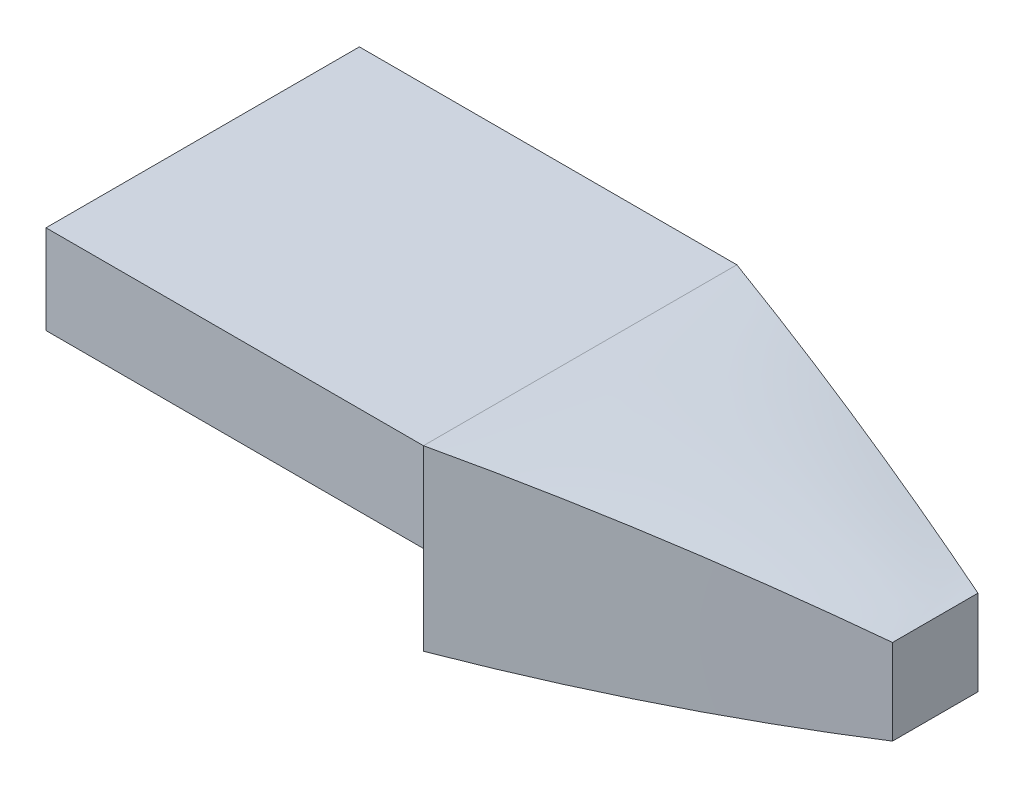
ISO-10303-21;
HEADER;
FILE_DESCRIPTION(('STEP AP214'),'2;1');
FILE_NAME('part.step','',(''),(''),'','','');
FILE_SCHEMA(('AUTOMOTIVE_DESIGN { 1 0 10303 214 1 1 1 1 }'));
ENDSEC;
DATA;
#1=APPLICATION_CONTEXT('core data for automotive mechanical design processes');
#2=APPLICATION_PROTOCOL_DEFINITION('international standard','automotive_design',2000,#1);
#3=PRODUCT_CONTEXT('',#1,'mechanical');
#4=PRODUCT('Part','Part','',(#3));
#5=PRODUCT_RELATED_PRODUCT_CATEGORY('part','',(#4));
#6=PRODUCT_DEFINITION_FORMATION('','',#4);
#7=PRODUCT_DEFINITION_CONTEXT('part definition',#1,'design');
#8=PRODUCT_DEFINITION('design','',#6,#7);
#9=PRODUCT_DEFINITION_SHAPE('','',#8);
#10=(LENGTH_UNIT() NAMED_UNIT(*) SI_UNIT(.MILLI.,.METRE.));
#11=(NAMED_UNIT(*) PLANE_ANGLE_UNIT() SI_UNIT($,.RADIAN.));
#12=(NAMED_UNIT(*) SI_UNIT($,.STERADIAN.) SOLID_ANGLE_UNIT());
#13=UNCERTAINTY_MEASURE_WITH_UNIT(LENGTH_MEASURE(1.E-05),#10,'distance_accuracy_value','');
#14=(GEOMETRIC_REPRESENTATION_CONTEXT(3) GLOBAL_UNCERTAINTY_ASSIGNED_CONTEXT((#13)) GLOBAL_UNIT_ASSIGNED_CONTEXT((#10,
#11,#12)) REPRESENTATION_CONTEXT('',''));
#15=CARTESIAN_POINT('',(0.,0.,0.));
#16=DIRECTION('',(0.,0.,1.));
#17=DIRECTION('',(1.,0.,0.));
#18=AXIS2_PLACEMENT_3D('',#15,#16,#17);
#19=CARTESIAN_POINT('',(0.,0.,0.));
#20=DIRECTION('',(1.,0.,0.));
#21=DIRECTION('',(0.,0.,-1.));
#22=AXIS2_PLACEMENT_3D('',#19,#20,#21);
#23=PLANE('',#22);
#24=DIRECTION('',(0.,0.,1.));
#25=VECTOR('',#24,1.);
#26=CARTESIAN_POINT('',(0.,-0.236966824644549,10.3667767351286));
#27=LINE('',#26,#25);
#28=CARTESIAN_POINT('',(0.,-0.236966824644549,10.3667767351286));
#29=VERTEX_POINT('',#28);
#30=CARTESIAN_POINT('',(0.,-0.236966824644549,12.3222748815166));
#31=VERTEX_POINT('',#30);
#32=EDGE_CURVE('E133',#29,#31,#27,.T.);
#33=ORIENTED_EDGE('',*,*,#32,.F.);
#34=DIRECTION('',(0.,-1.,0.));
#35=VECTOR('',#34,1.);
#36=CARTESIAN_POINT('',(0.,10.0495975345529,10.3667767351286));
#37=LINE('',#36,#35);
#38=CARTESIAN_POINT('',(0.,10.0495975345529,10.3667767351286));
#39=VERTEX_POINT('',#38);
#40=EDGE_CURVE('E150',#39,#29,#37,.T.);
#41=ORIENTED_EDGE('',*,*,#40,.F.);
#42=DIRECTION('',(0.,0.,1.));
#43=VECTOR('',#42,1.);
#44=CARTESIAN_POINT('',(0.,10.0495975345529,-29.6332232648714));
#45=LINE('',#44,#43);
#46=CARTESIAN_POINT('',(0.,10.0495975345529,-29.6332232648714));
#47=VERTEX_POINT('',#46);
#48=EDGE_CURVE('E335',#47,#39,#45,.T.);
#49=ORIENTED_EDGE('',*,*,#48,.F.);
#50=DIRECTION('',(0.,0.999792471113605,-0.0203719096932906));
#51=VECTOR('',#50,1.);
#52=CARTESIAN_POINT('',(0.,-0.236966824644549,-29.4236228065419));
#53=LINE('',#52,#51);
#54=CARTESIAN_POINT('',(0.,-0.236966824644549,-29.4236228065419));
#55=VERTEX_POINT('',#54);
#56=EDGE_CURVE('E332',#55,#47,#53,.T.);
#57=ORIENTED_EDGE('',*,*,#56,.F.);
#58=DIRECTION('',(0.,0.,1.));
#59=VECTOR('',#58,1.);
#60=CARTESIAN_POINT('',(0.,-0.236966824644549,-31.6777251184834));
#61=LINE('',#60,#59);
#62=CARTESIAN_POINT('',(0.,-0.236966824644548,-31.6777251184834));
#63=VERTEX_POINT('',#62);
#64=EDGE_CURVE('E274',#63,#55,#61,.T.);
#65=ORIENTED_EDGE('',*,*,#64,.F.);
#66=DIRECTION('',(0.,1.,0.));
#67=VECTOR('',#66,1.);
#68=CARTESIAN_POINT('',(0.,12.2630331753555,-31.6777251184834));
#69=LINE('',#68,#67);
#70=CARTESIAN_POINT('',(0.,-12.7369668246445,-31.6777251184834));
#71=VERTEX_POINT('',#70);
#72=EDGE_CURVE('E139',#71,#63,#69,.T.);
#73=ORIENTED_EDGE('',*,*,#72,.F.);
#74=DIRECTION('',(0.,0.,-1.));
#75=VECTOR('',#74,1.);
#76=CARTESIAN_POINT('',(0.,-12.7369668246445,12.3222748815166));
#77=LINE('',#76,#75);
#78=CARTESIAN_POINT('',(0.,-12.7369668246445,12.3222748815166));
#79=VERTEX_POINT('',#78);
#80=EDGE_CURVE('E247',#79,#71,#77,.T.);
#81=ORIENTED_EDGE('',*,*,#80,.F.);
#82=DIRECTION('',(0.,-1.,0.));
#83=VECTOR('',#82,1.);
#84=CARTESIAN_POINT('',(0.,12.2630331753555,12.3222748815166));
#85=LINE('',#84,#83);
#86=EDGE_CURVE('E248',#31,#79,#85,.T.);
#87=ORIENTED_EDGE('',*,*,#86,.F.);
#88=EDGE_LOOP('',(#33,#41,#49,#57,#65,#73,#81,#87));
#89=FACE_BOUND('',#88,.T.);
#90=ADVANCED_FACE('F128',(#89),#23,.F.);
#91=CARTESIAN_POINT('',(50.,0.,0.));
#92=DIRECTION('',(-1.,0.,0.));
#93=DIRECTION('',(0.,0.,1.));
#94=AXIS2_PLACEMENT_3D('',#91,#92,#93);
#95=PLANE('',#94);
#96=DIRECTION('',(0.,0.,-1.));
#97=VECTOR('',#96,1.);
#98=CARTESIAN_POINT('',(50.,5.40660237121914,-3.54022382107117));
#99=LINE('',#98,#97);
#100=CARTESIAN_POINT('',(50.,5.40660237121914,-3.54022382107117));
#101=VERTEX_POINT('',#100);
#102=CARTESIAN_POINT('',(50.,5.40660237121914,-15.5402238210712));
#103=VERTEX_POINT('',#102);
#104=EDGE_CURVE('E234',#101,#103,#99,.T.);
#105=ORIENTED_EDGE('',*,*,#104,.F.);
#106=DIRECTION('',(0.,-1.,0.));
#107=VECTOR('',#106,1.);
#108=CARTESIAN_POINT('',(50.,5.40660237121914,-3.54022382107117));
#109=LINE('',#108,#107);
#110=CARTESIAN_POINT('',(50.,-6.59339762878086,-3.54022382107117));
#111=VERTEX_POINT('',#110);
#112=EDGE_CURVE('E664',#101,#111,#109,.T.);
#113=ORIENTED_EDGE('',*,*,#112,.T.);
#114=DIRECTION('',(0.,0.,-1.));
#115=VECTOR('',#114,1.);
#116=CARTESIAN_POINT('',(50.,-6.59339762878086,-3.54022382107117));
#117=LINE('',#116,#115);
#118=CARTESIAN_POINT('',(50.,-6.59339762878086,-15.5402238210712));
#119=VERTEX_POINT('',#118);
#120=EDGE_CURVE('E653',#111,#119,#117,.T.);
#121=ORIENTED_EDGE('',*,*,#120,.T.);
#122=DIRECTION('',(0.,-1.,0.));
#123=VECTOR('',#122,1.);
#124=CARTESIAN_POINT('',(50.,5.40660237121914,-15.5402238210712));
#125=LINE('',#124,#123);
#126=EDGE_CURVE('E237',#103,#119,#125,.T.);
#127=ORIENTED_EDGE('',*,*,#126,.F.);
#128=EDGE_LOOP('',(#105,#113,#121,#127));
#129=FACE_BOUND('',#128,.T.);
#130=ADVANCED_FACE('F130',(#129),#95,.F.);
#131=CARTESIAN_POINT('',(0.,12.2630331753555,-31.6777251184834));
#132=CARTESIAN_POINT('',(16.8633748358364,11.1045639885698,-26.2442051551531));
#133=CARTESIAN_POINT('',(33.633024031838,8.81021567785348,-20.8647548513878));
#134=CARTESIAN_POINT('',(50.,5.40660237121914,-15.5402238210712));
#135=CARTESIAN_POINT('',(0.,12.2630331753554,-30.1209740636311));
#136=CARTESIAN_POINT('',(16.8641422945816,11.2119200817755,-25.007244512965));
#137=CARTESIAN_POINT('',(33.6338023490713,8.91679757791005,-19.9479770204075));
#138=CARTESIAN_POINT('',(50.,5.40660237121914,-14.9440212894256));
#139=CARTESIAN_POINT('',(0.,12.2630331753554,-26.8050343202545));
#140=CARTESIAN_POINT('',(16.865561607527,11.4104609073117,-22.4405203669415));
#141=CARTESIAN_POINT('',(33.6352417433472,9.11390663611594,-18.1311941606893));
#142=CARTESIAN_POINT('',(50.,5.40660237121914,-13.8779055706373));
#143=CARTESIAN_POINT('',(0.,12.2630331753555,-21.2442628736588));
#144=CARTESIAN_POINT('',(16.8672293730978,11.6437565693509,-18.245194748866));
#145=CARTESIAN_POINT('',(33.6369331055121,9.34551989804267,-15.3021670929056));
#146=CARTESIAN_POINT('',(50.,5.40660237121913,-12.4160299695909));
#147=CARTESIAN_POINT('',(0.,12.2630331753554,-15.3481027324033));
#148=CARTESIAN_POINT('',(16.8683215446097,11.7965351614858,-13.8424235595652));
#149=CARTESIAN_POINT('',(33.6380407297521,9.49719673492698,-12.3933432784237));
#150=CARTESIAN_POINT('',(50.,5.40660237121914,-11.0017120802782));
#151=CARTESIAN_POINT('',(0.,12.2630331753554,-11.5110584518168));
#152=CARTESIAN_POINT('',(16.8685896694371,11.8340418472134,-10.9637608512026));
#153=CARTESIAN_POINT('',(33.6383126481779,9.53443294304801,-10.4731992334218));
#154=CARTESIAN_POINT('',(50.,5.40660237121914,-10.0402238210712));
#155=CARTESIAN_POINT('',(0.,12.2630331753554,-9.67772511848342));
#156=CARTESIAN_POINT('',(16.8685896694371,11.8340418472134,-9.57487196231374));
#157=CARTESIAN_POINT('',(33.6383126481779,9.53443294304801,-9.52875478897733));
#158=CARTESIAN_POINT('',(50.,5.40660237121914,-9.54022382107116));
#159=CARTESIAN_POINT('',(0.,12.2630331753554,-7.84439178515008));
#160=CARTESIAN_POINT('',(16.8685896694371,11.8340418472134,-8.18598307342485));
#161=CARTESIAN_POINT('',(33.6383126481779,9.53443294304801,-8.58431034453288));
#162=CARTESIAN_POINT('',(50.,5.40660237121914,-9.04022382107116));
#163=CARTESIAN_POINT('',(0.,12.2630331753554,-4.00734750456362));
#164=CARTESIAN_POINT('',(16.8683215446097,11.7965351614858,-5.30759456820078));
#165=CARTESIAN_POINT('',(33.6380407297521,9.49719673492698,-6.66444052353444));
#166=CARTESIAN_POINT('',(50.,5.40660237121913,-8.07873556186414));
#167=CARTESIAN_POINT('',(0.,12.2630331753555,1.88881263669199));
#168=CARTESIAN_POINT('',(16.8672293730978,11.6437565693509,-0.905940309618936));
#169=CARTESIAN_POINT('',(33.6369331055121,9.34551989804268,-3.7567337247623));
#170=CARTESIAN_POINT('',(50.,5.40660237121915,-6.66441767255141));
#171=CARTESIAN_POINT('',(0.,12.2630331753554,7.44958408328762));
#172=CARTESIAN_POINT('',(16.865561607527,11.4104609073117,3.28767973513059));
#173=CARTESIAN_POINT('',(33.6352417433472,9.11390663611594,-0.929412360087117));
#174=CARTESIAN_POINT('',(50.,5.40660237121914,-5.20254207150508));
#175=CARTESIAN_POINT('',(0.,12.2630331753554,10.7655238266643));
#176=CARTESIAN_POINT('',(16.8641422945816,11.2119200817755,5.85295239280151));
#177=CARTESIAN_POINT('',(33.6338023490713,8.91679757791005,0.885918900830184));
#178=CARTESIAN_POINT('',(50.,5.40660237121914,-4.13642635271674));
#179=CARTESIAN_POINT('',(0.,12.2630331753555,12.3222748815166));
#180=CARTESIAN_POINT('',(16.8633748358364,11.1045639885698,7.08912817818021));
#181=CARTESIAN_POINT('',(33.633024031838,8.81021567785348,1.80191181527885));
#182=CARTESIAN_POINT('',(50.,5.40660237121914,-3.54022382107117));
#183=B_SPLINE_SURFACE_WITH_KNOTS('',3,3,((#131,#132,#133,#134),(#135,#136,#137,#138),(#139,#140,
#141,#142),(#143,#144,#145,#146),(#147,#148,#149,#150),(#151,#152,#153,#154),(#155,#156,#157,
#158),(#159,#160,#161,#162),(#163,#164,#165,#166),(#167,#168,#169,#170),(#171,#172,#173,#174),
(#175,#176,#177,#178),(#179,#180,#181,#182)),.UNSPECIFIED.,.F.,.F.,.F.,(4,1,1,1,3,1,1,1,4),(4,
4),(0.715579710144927,0.751132246376812,0.786684782608696,0.82223731884058,0.857789855072464,
0.893342391304348,0.928894927536232,0.964447463768116,1.),(0.,1.),.UNSPECIFIED.);
#184=DIRECTION('',(0.,0.,1.));
#185=VECTOR('',#184,1.);
#186=CARTESIAN_POINT('',(0.,12.2630331753555,12.3222748815166));
#187=LINE('',#186,#185);
#188=CARTESIAN_POINT('',(0.,12.2630331753555,-31.6777251184834));
#189=VERTEX_POINT('',#188);
#190=CARTESIAN_POINT('',(0.,12.2630331753555,12.3222748815166));
#191=VERTEX_POINT('',#190);
#192=EDGE_CURVE('E13',#189,#191,#187,.T.);
#193=CARTESIAN_POINT('',(0.,12.2630331753555,12.3222748815166));
#194=CARTESIAN_POINT('',(16.8633748358364,11.1045639885698,7.08912817818021));
#195=CARTESIAN_POINT('',(33.633024031838,8.81021567785348,1.80191181527885));
#196=CARTESIAN_POINT('',(50.,5.40660237121914,-3.54022382107117));
#197=B_SPLINE_CURVE_WITH_KNOTS('',3,(#193,#194,#195,#196),.UNSPECIFIED.,.F.,.F.,(4,4),(0.,1.),.UNSPECIFIED.);
#198=EDGE_CURVE('E619',#191,#101,#197,.T.);
#199=CARTESIAN_POINT('',(0.,12.2630331753555,-31.6777251184834));
#200=CARTESIAN_POINT('',(16.8633748358364,11.1045639885698,-26.2442051551531));
#201=CARTESIAN_POINT('',(33.633024031838,8.81021567785348,-20.8647548513878));
#202=CARTESIAN_POINT('',(50.,5.40660237121914,-15.5402238210712));
#203=B_SPLINE_CURVE_WITH_KNOTS('',3,(#199,#200,#201,#202),.UNSPECIFIED.,.F.,.F.,(4,4),(0.,1.),.UNSPECIFIED.);
#204=EDGE_CURVE('E354',#189,#103,#203,.T.);
#205=ORIENTED_EDGE('',*,*,#192,.T.);
#206=ORIENTED_EDGE('',*,*,#198,.T.);
#207=ORIENTED_EDGE('',*,*,#104,.T.);
#208=ORIENTED_EDGE('',*,*,#204,.F.);
#209=EDGE_LOOP('',(#205,#206,#207,#208));
#210=FACE_BOUND('',#209,.T.);
#211=ADVANCED_FACE('F356',(#210),#183,.T.);
#212=CARTESIAN_POINT('',(0.,-12.7369668246445,-31.6777251184834));
#213=CARTESIAN_POINT('',(16.847288633858,-11.8123236959099,-26.2524305908772));
#214=CARTESIAN_POINT('',(33.6167102321768,-9.75711131586865,-20.8729809130114));
#215=CARTESIAN_POINT('',(50.,-6.59339762878086,-15.5402238210712));
#216=CARTESIAN_POINT('',(0.,-10.6536334913112,-31.6777251184834));
#217=CARTESIAN_POINT('',(16.8484520426566,-9.92735784194907,-26.2518356994102));
#218=CARTESIAN_POINT('',(33.6178901016133,-8.23443019065904,-20.8723859762772));
#219=CARTESIAN_POINT('',(50.,-5.59339762878086,-15.5402238210712));
#220=CARTESIAN_POINT('',(0.,-6.48696682464455,-31.6777251184834));
#221=CARTESIAN_POINT('',(16.8510445223031,-6.12026395440867,-26.2505100742112));
#222=CARTESIAN_POINT('',(33.6205192612892,-5.15217375383897,-20.8710602502072));
#223=CARTESIAN_POINT('',(50.,-3.59339762878086,-15.5402238210712));
#224=CARTESIAN_POINT('',(0.,-0.236966824644544,-31.6777251184834));
#225=CARTESIAN_POINT('',(16.8553317348472,-0.353879853670078,-26.2483178730151));
#226=CARTESIAN_POINT('',(33.6248671320074,-0.473447819007584,-20.8688678821996));
#227=CARTESIAN_POINT('',(50.,-0.593397628780857,-15.5402238210712));
#228=CARTESIAN_POINT('',(0.,6.01303317535545,-31.6777251184834));
#229=CARTESIAN_POINT('',(16.8596189473912,5.4125042470685,-26.2461256718191));
#230=CARTESIAN_POINT('',(33.6292150027256,4.20527811582379,-20.866675514192));
#231=CARTESIAN_POINT('',(50.,2.40660237121914,-15.5402238210712));
#232=CARTESIAN_POINT('',(0.,10.1796998420221,-31.6777251184834));
#233=CARTESIAN_POINT('',(16.8622114270378,9.21959813460891,-26.2448000466201));
#234=CARTESIAN_POINT('',(33.6318441624015,7.28753455264387,-20.865349788122));
#235=CARTESIAN_POINT('',(50.,4.40660237121914,-15.5402238210712));
#236=CARTESIAN_POINT('',(0.,12.2630331753555,-31.6777251184834));
#237=CARTESIAN_POINT('',(16.8633748358364,11.1045639885698,-26.2442051551531));
#238=CARTESIAN_POINT('',(33.633024031838,8.81021567785348,-20.8647548513878));
#239=CARTESIAN_POINT('',(50.,5.40660237121914,-15.5402238210712));
#240=B_SPLINE_SURFACE_WITH_KNOTS('',3,3,((#212,#213,#214,#215),(#216,#217,#218,#219),(#220,#221,
#222,#223),(#224,#225,#226,#227),(#228,#229,#230,#231),(#232,#233,#234,#235),(#236,#237,#238,
#239)),.UNSPECIFIED.,.F.,.F.,.F.,(4,1,1,1,4),(4,4),(0.5,0.553894927536232,0.607789855072464,
0.661684782608696,0.715579710144927),(0.,1.),.UNSPECIFIED.);
#241=DIRECTION('',(0.,-1.,0.));
#242=VECTOR('',#241,1.);
#243=CARTESIAN_POINT('',(0.,12.2630331753555,-31.6777251184834));
#244=LINE('',#243,#242);
#245=EDGE_CURVE('E270',#189,#63,#244,.T.);
#246=CARTESIAN_POINT('',(0.,-12.7369668246445,-31.6777251184834));
#247=CARTESIAN_POINT('',(16.847288633858,-11.8123236959099,-26.2524305908772));
#248=CARTESIAN_POINT('',(33.6167102321768,-9.75711131586865,-20.8729809130114));
#249=CARTESIAN_POINT('',(50.,-6.59339762878086,-15.5402238210712));
#250=B_SPLINE_CURVE_WITH_KNOTS('',3,(#246,#247,#248,#249),.UNSPECIFIED.,.F.,.F.,(4,4),(0.,1.),.UNSPECIFIED.);
#251=EDGE_CURVE('E436',#71,#119,#250,.T.);
#252=ORIENTED_EDGE('',*,*,#72,.T.);
#253=ORIENTED_EDGE('',*,*,#245,.F.);
#254=ORIENTED_EDGE('',*,*,#204,.T.);
#255=ORIENTED_EDGE('',*,*,#126,.T.);
#256=ORIENTED_EDGE('',*,*,#251,.F.);
#257=EDGE_LOOP('',(#252,#253,#254,#255,#256));
#258=FACE_BOUND('',#257,.T.);
#259=ADVANCED_FACE('F367',(#258),#240,.T.);
#260=CARTESIAN_POINT('',(0.,-12.7369668246445,12.3222748815166));
#261=CARTESIAN_POINT('',(16.847288633858,-11.8123236959099,7.08090274245618));
#262=CARTESIAN_POINT('',(33.6167102321768,-9.75711131586865,1.79368575365528));
#263=CARTESIAN_POINT('',(50.,-6.59339762878086,-3.54022382107117));
#264=CARTESIAN_POINT('',(0.,-12.7369668246445,10.7655238266643));
#265=CARTESIAN_POINT('',(16.8465211751128,-11.9196797891157,5.84394210026807));
#266=CARTESIAN_POINT('',(33.6159319149435,-9.86369321592522,0.876907922674967));
#267=CARTESIAN_POINT('',(50.,-6.59339762878086,-4.13642635271674));
#268=CARTESIAN_POINT('',(0.,-12.7369668246446,7.44958408328762));
#269=CARTESIAN_POINT('',(16.8451018621674,-12.1182206146519,3.27721795424457));
#270=CARTESIAN_POINT('',(33.6144925206677,-10.0608022741311,-0.939874937043279));
#271=CARTESIAN_POINT('',(50.,-6.59339762878086,-5.20254207150509));
#272=CARTESIAN_POINT('',(0.,-12.7369668246445,1.88881263669198));
#273=CARTESIAN_POINT('',(16.8434340965966,-12.3515162766911,-0.918107663830968));
#274=CARTESIAN_POINT('',(33.6128011585027,-10.2924155360578,-3.76890200482696));
#275=CARTESIAN_POINT('',(50.,-6.59339762878086,-6.66441767255142));
#276=CARTESIAN_POINT('',(0.,-12.7369668246446,-4.00734750456363));
#277=CARTESIAN_POINT('',(16.8423419250847,-12.504294868826,-5.32087885313177));
#278=CARTESIAN_POINT('',(33.6116935342627,-10.4440923729422,-6.67772581930888));
#279=CARTESIAN_POINT('',(50.,-6.59339762878086,-8.07873556186417));
#280=CARTESIAN_POINT('',(0.,-12.7369668246445,-7.84439178515009));
#281=CARTESIAN_POINT('',(16.8420738002572,-12.5418015545536,-8.19954156149432));
#282=CARTESIAN_POINT('',(33.6114216158369,-10.4813285810632,-8.59786986431078));
#283=CARTESIAN_POINT('',(50.,-6.59339762878086,-9.04022382107119));
#284=CARTESIAN_POINT('',(0.,-12.7369668246445,-11.5110584518168));
#285=CARTESIAN_POINT('',(16.8420738002572,-12.5418015545536,-10.9773193392721));
#286=CARTESIAN_POINT('',(33.6114216158369,-10.4813285810632,-10.4867587531997));
#287=CARTESIAN_POINT('',(50.,-6.59339762878086,-10.0402238210712));
#288=CARTESIAN_POINT('',(0.,-12.7369668246446,-15.3481027324032));
#289=CARTESIAN_POINT('',(16.8423419250847,-12.504294868826,-13.8557078444962));
#290=CARTESIAN_POINT('',(33.6116935342627,-10.4440923729422,-12.4066285741981));
#291=CARTESIAN_POINT('',(50.,-6.59339762878086,-11.0017120802782));
#292=CARTESIAN_POINT('',(0.,-12.7369668246445,-21.2442628736589));
#293=CARTESIAN_POINT('',(16.8434340965966,-12.3515162766911,-18.257362103078));
#294=CARTESIAN_POINT('',(33.6128011585027,-10.2924155360578,-15.3143353729703));
#295=CARTESIAN_POINT('',(50.,-6.59339762878086,-12.4160299695909));
#296=CARTESIAN_POINT('',(0.,-12.7369668246446,-26.8050343202544));
#297=CARTESIAN_POINT('',(16.8451018621674,-12.1182206146519,-22.4509821478275));
#298=CARTESIAN_POINT('',(33.6144925206676,-10.0608022741311,-18.1416567376454));
#299=CARTESIAN_POINT('',(50.,-6.59339762878086,-13.8779055706373));
#300=CARTESIAN_POINT('',(0.,-12.7369668246445,-30.1209740636311));
#301=CARTESIAN_POINT('',(16.8465211751127,-11.9196797891157,-25.0162548054985));
#302=CARTESIAN_POINT('',(33.6159319149435,-9.86369321592522,-19.9569879985627));
#303=CARTESIAN_POINT('',(50.,-6.59339762878086,-14.9440212894256));
#304=CARTESIAN_POINT('',(0.,-12.7369668246445,-31.6777251184834));
#305=CARTESIAN_POINT('',(16.847288633858,-11.8123236959099,-26.2524305908772));
#306=CARTESIAN_POINT('',(33.6167102321768,-9.75711131586865,-20.8729809130114));
#307=CARTESIAN_POINT('',(50.,-6.59339762878086,-15.5402238210712));
#308=B_SPLINE_SURFACE_WITH_KNOTS('',3,3,((#260,#261,#262,#263),(#264,#265,#266,#267),(#268,#269,
#270,#271),(#272,#273,#274,#275),(#276,#277,#278,#279),(#280,#281,#282,#283),(#284,#285,#286,
#287),(#288,#289,#290,#291),(#292,#293,#294,#295),(#296,#297,#298,#299),(#300,#301,#302,#303),
(#304,#305,#306,#307)),.UNSPECIFIED.,.F.,.F.,.F.,(4,1,1,1,2,1,1,1,4),(4,4),(0.215579710144927,
0.251132246376812,0.286684782608696,0.32223731884058,0.357789855072464,0.393342391304348,
0.428894927536232,0.464447463768116,0.5),(0.,1.),.UNSPECIFIED.);
#309=CARTESIAN_POINT('',(0.,-12.7369668246445,12.3222748815166));
#310=CARTESIAN_POINT('',(16.847288633858,-11.8123236959099,7.08090274245618));
#311=CARTESIAN_POINT('',(33.6167102321768,-9.75711131586865,1.79368575365528));
#312=CARTESIAN_POINT('',(50.,-6.59339762878086,-3.54022382107117));
#313=B_SPLINE_CURVE_WITH_KNOTS('',3,(#309,#310,#311,#312),.UNSPECIFIED.,.F.,.F.,(4,4),(0.,1.),.UNSPECIFIED.);
#314=EDGE_CURVE('E443',#79,#111,#313,.T.);
#315=ORIENTED_EDGE('',*,*,#80,.T.);
#316=ORIENTED_EDGE('',*,*,#251,.T.);
#317=ORIENTED_EDGE('',*,*,#120,.F.);
#318=ORIENTED_EDGE('',*,*,#314,.F.);
#319=EDGE_LOOP('',(#315,#316,#317,#318));
#320=FACE_BOUND('',#319,.T.);
#321=ADVANCED_FACE('F407',(#320),#308,.T.);
#322=CARTESIAN_POINT('',(0.,12.2630331753555,12.3222748815166));
#323=CARTESIAN_POINT('',(16.8633748358364,11.1045639885698,7.08912817818021));
#324=CARTESIAN_POINT('',(33.633024031838,8.81021567785348,1.80191181527885));
#325=CARTESIAN_POINT('',(50.,5.40660237121914,-3.54022382107117));
#326=CARTESIAN_POINT('',(0.,10.1796998420221,12.3222748815166));
#327=CARTESIAN_POINT('',(16.8622114270378,9.21959813460892,7.08853328671321));
#328=CARTESIAN_POINT('',(33.6318441624015,7.28753455264387,1.80131687854466));
#329=CARTESIAN_POINT('',(50.,4.40660237121914,-3.54022382107117));
#330=CARTESIAN_POINT('',(0.,6.01303317535546,12.3222748815166));
#331=CARTESIAN_POINT('',(16.8596189473913,5.41250424706852,7.08720766151422));
#332=CARTESIAN_POINT('',(33.6292150027257,4.2052781158238,1.79999115247463));
#333=CARTESIAN_POINT('',(50.0000000000001,2.40660237121914,-3.54022382107118));
#334=CARTESIAN_POINT('',(0.,-0.236966824644553,12.3222748815166));
#335=CARTESIAN_POINT('',(16.8553317348472,-0.353879853670084,7.08501546031819));
#336=CARTESIAN_POINT('',(33.6248671320074,-0.473447819007589,1.79779878446706));
#337=CARTESIAN_POINT('',(49.9999999999999,-0.593397628780864,-3.54022382107117));
#338=CARTESIAN_POINT('',(0.,-6.48696682464455,12.3222748815166));
#339=CARTESIAN_POINT('',(16.8510445223032,-6.12026395440867,7.08282325912219));
#340=CARTESIAN_POINT('',(33.6205192612893,-5.15217375383897,1.7956064164595));
#341=CARTESIAN_POINT('',(50.,-3.59339762878086,-3.54022382107118));
#342=CARTESIAN_POINT('',(0.,-10.6536334913112,12.3222748815166));
#343=CARTESIAN_POINT('',(16.8484520426566,-9.92735784194907,7.08149763392318));
#344=CARTESIAN_POINT('',(33.6178901016133,-8.23443019065904,1.79428069038946));
#345=CARTESIAN_POINT('',(50.,-5.59339762878086,-3.54022382107117));
#346=CARTESIAN_POINT('',(0.,-12.7369668246445,12.3222748815166));
#347=CARTESIAN_POINT('',(16.847288633858,-11.8123236959099,7.08090274245618));
#348=CARTESIAN_POINT('',(33.6167102321768,-9.75711131586865,1.79368575365528));
#349=CARTESIAN_POINT('',(50.,-6.59339762878086,-3.54022382107117));
#350=B_SPLINE_SURFACE_WITH_KNOTS('',3,3,((#322,#323,#324,#325),(#326,#327,#328,#329),(#330,#331,
#332,#333),(#334,#335,#336,#337),(#338,#339,#340,#341),(#342,#343,#344,#345),(#346,#347,#348,
#349)),.UNSPECIFIED.,.F.,.F.,.F.,(4,1,1,1,4),(4,4),(0.,0.0538949275362319,0.107789855072464,
0.161684782608696,0.215579710144927),(0.,1.),.UNSPECIFIED.);
#351=EDGE_CURVE('E242',#191,#31,#85,.T.);
#352=ORIENTED_EDGE('',*,*,#351,.T.);
#353=ORIENTED_EDGE('',*,*,#86,.T.);
#354=ORIENTED_EDGE('',*,*,#314,.T.);
#355=ORIENTED_EDGE('',*,*,#112,.F.);
#356=ORIENTED_EDGE('',*,*,#198,.F.);
#357=EDGE_LOOP('',(#352,#353,#354,#355,#356));
#358=FACE_BOUND('',#357,.T.);
#359=ADVANCED_FACE('F418',(#358),#350,.T.);
#360=CARTESIAN_POINT('',(-53.,-0.236966824644549,10.3667767351286));
#361=DIRECTION('',(0.,1.,0.));
#362=DIRECTION('',(0.,0.,1.));
#363=AXIS2_PLACEMENT_3D('',#360,#361,#362);
#364=PLANE('',#363);
#365=ORIENTED_EDGE('',*,*,#32,.T.);
#366=DIRECTION('',(1.,0.,0.));
#367=VECTOR('',#366,1.);
#368=CARTESIAN_POINT('',(-53.,-0.236966824644549,12.3222748815166));
#369=LINE('',#368,#367);
#370=CARTESIAN_POINT('',(-53.,-0.236966824644549,12.3222748815166));
#371=VERTEX_POINT('',#370);
#372=EDGE_CURVE('E217',#371,#31,#369,.T.);
#373=ORIENTED_EDGE('',*,*,#372,.F.);
#374=DIRECTION('',(0.,0.,1.));
#375=VECTOR('',#374,1.);
#376=CARTESIAN_POINT('',(-53.,-0.236966824644549,10.3667767351286));
#377=LINE('',#376,#375);
#378=CARTESIAN_POINT('',(-53.,-0.236966824644549,10.3667767351286));
#379=VERTEX_POINT('',#378);
#380=EDGE_CURVE('E223',#379,#371,#377,.T.);
#381=ORIENTED_EDGE('',*,*,#380,.F.);
#382=DIRECTION('',(1.,0.,0.));
#383=VECTOR('',#382,1.);
#384=CARTESIAN_POINT('',(-53.,-0.236966824644549,10.3667767351286));
#385=LINE('',#384,#383);
#386=EDGE_CURVE('E329',#379,#29,#385,.T.);
#387=ORIENTED_EDGE('',*,*,#386,.T.);
#388=EDGE_LOOP('',(#365,#373,#381,#387));
#389=FACE_BOUND('',#388,.T.);
#390=ADVANCED_FACE('F233',(#389),#364,.F.);
#391=CARTESIAN_POINT('',(-53.,-0.236966824644549,12.3222748815166));
#392=DIRECTION('',(0.,0.,-1.));
#393=DIRECTION('',(-1.,0.,0.));
#394=AXIS2_PLACEMENT_3D('',#391,#392,#393);
#395=PLANE('',#394);
#396=ORIENTED_EDGE('',*,*,#351,.F.);
#397=DIRECTION('',(1.,0.,0.));
#398=VECTOR('',#397,1.);
#399=CARTESIAN_POINT('',(-53.,12.2630331753555,12.3222748815166));
#400=LINE('',#399,#398);
#401=CARTESIAN_POINT('',(-53.,12.2630331753555,12.3222748815166));
#402=VERTEX_POINT('',#401);
#403=EDGE_CURVE('E219',#402,#191,#400,.T.);
#404=ORIENTED_EDGE('',*,*,#403,.F.);
#405=DIRECTION('',(0.,1.,0.));
#406=VECTOR('',#405,1.);
#407=CARTESIAN_POINT('',(-53.,-0.236966824644549,12.3222748815166));
#408=LINE('',#407,#406);
#409=EDGE_CURVE('E212',#371,#402,#408,.T.);
#410=ORIENTED_EDGE('',*,*,#409,.F.);
#411=ORIENTED_EDGE('',*,*,#372,.T.);
#412=EDGE_LOOP('',(#396,#404,#410,#411));
#413=FACE_BOUND('',#412,.T.);
#414=ADVANCED_FACE('F215',(#413),#395,.F.);
#415=CARTESIAN_POINT('',(-53.,12.2630331753555,12.3222748815166));
#416=DIRECTION('',(0.,-1.,0.));
#417=DIRECTION('',(0.,0.,-1.));
#418=AXIS2_PLACEMENT_3D('',#415,#416,#417);
#419=PLANE('',#418);
#420=ORIENTED_EDGE('',*,*,#192,.F.);
#421=DIRECTION('',(1.,0.,0.));
#422=VECTOR('',#421,1.);
#423=CARTESIAN_POINT('',(-53.,12.2630331753555,-31.6777251184834));
#424=LINE('',#423,#422);
#425=CARTESIAN_POINT('',(-53.,12.2630331753555,-31.6777251184834));
#426=VERTEX_POINT('',#425);
#427=EDGE_CURVE('E239',#426,#189,#424,.T.);
#428=ORIENTED_EDGE('',*,*,#427,.F.);
#429=DIRECTION('',(0.,0.,-1.));
#430=VECTOR('',#429,1.);
#431=CARTESIAN_POINT('',(-53.,12.2630331753555,12.3222748815166));
#432=LINE('',#431,#430);
#433=EDGE_CURVE('E222',#402,#426,#432,.T.);
#434=ORIENTED_EDGE('',*,*,#433,.F.);
#435=ORIENTED_EDGE('',*,*,#403,.T.);
#436=EDGE_LOOP('',(#420,#428,#434,#435));
#437=FACE_BOUND('',#436,.T.);
#438=ADVANCED_FACE('F290',(#437),#419,.F.);
#439=CARTESIAN_POINT('',(-53.,12.2630331753555,-31.6777251184834));
#440=DIRECTION('',(0.,0.,1.));
#441=DIRECTION('',(1.,0.,0.));
#442=AXIS2_PLACEMENT_3D('',#439,#440,#441);
#443=PLANE('',#442);
#444=ORIENTED_EDGE('',*,*,#245,.T.);
#445=DIRECTION('',(1.,0.,0.));
#446=VECTOR('',#445,1.);
#447=CARTESIAN_POINT('',(-53.,-0.236966824644549,-31.6777251184834));
#448=LINE('',#447,#446);
#449=CARTESIAN_POINT('',(-53.,-0.236966824644549,-31.6777251184834));
#450=VERTEX_POINT('',#449);
#451=EDGE_CURVE('E267',#450,#63,#448,.T.);
#452=ORIENTED_EDGE('',*,*,#451,.F.);
#453=DIRECTION('',(0.,-1.,0.));
#454=VECTOR('',#453,1.);
#455=CARTESIAN_POINT('',(-53.,12.2630331753555,-31.6777251184834));
#456=LINE('',#455,#454);
#457=EDGE_CURVE('E319',#426,#450,#456,.T.);
#458=ORIENTED_EDGE('',*,*,#457,.F.);
#459=ORIENTED_EDGE('',*,*,#427,.T.);
#460=EDGE_LOOP('',(#444,#452,#458,#459));
#461=FACE_BOUND('',#460,.T.);
#462=ADVANCED_FACE('F299',(#461),#443,.F.);
#463=CARTESIAN_POINT('',(-53.,-0.236966824644549,-31.6777251184834));
#464=DIRECTION('',(0.,1.,0.));
#465=DIRECTION('',(0.,0.,1.));
#466=AXIS2_PLACEMENT_3D('',#463,#464,#465);
#467=PLANE('',#466);
#468=ORIENTED_EDGE('',*,*,#64,.T.);
#469=DIRECTION('',(1.,0.,0.));
#470=VECTOR('',#469,1.);
#471=CARTESIAN_POINT('',(-53.,-0.236966824644549,-29.4236228065419));
#472=LINE('',#471,#470);
#473=CARTESIAN_POINT('',(-53.,-0.236966824644549,-29.4236228065419));
#474=VERTEX_POINT('',#473);
#475=EDGE_CURVE('E345',#474,#55,#472,.T.);
#476=ORIENTED_EDGE('',*,*,#475,.F.);
#477=DIRECTION('',(0.,0.,1.));
#478=VECTOR('',#477,1.);
#479=CARTESIAN_POINT('',(-53.,-0.236966824644549,-31.6777251184834));
#480=LINE('',#479,#478);
#481=EDGE_CURVE('E321',#450,#474,#480,.T.);
#482=ORIENTED_EDGE('',*,*,#481,.F.);
#483=ORIENTED_EDGE('',*,*,#451,.T.);
#484=EDGE_LOOP('',(#468,#476,#482,#483));
#485=FACE_BOUND('',#484,.T.);
#486=ADVANCED_FACE('F470',(#485),#467,.F.);
#487=CARTESIAN_POINT('',(-53.,-0.236966824644549,-29.4236228065419));
#488=DIRECTION('',(0.,-0.0203719096932906,-0.999792471113605));
#489=DIRECTION('',(0.,0.999792471113605,-0.0203719096932906));
#490=AXIS2_PLACEMENT_3D('',#487,#488,#489);
#491=PLANE('',#490);
#492=ORIENTED_EDGE('',*,*,#56,.T.);
#493=DIRECTION('',(1.,0.,0.));
#494=VECTOR('',#493,1.);
#495=CARTESIAN_POINT('',(-53.,10.0495975345529,-29.6332232648714));
#496=LINE('',#495,#494);
#497=CARTESIAN_POINT('',(-53.,10.0495975345529,-29.6332232648714));
#498=VERTEX_POINT('',#497);
#499=EDGE_CURVE('E342',#498,#47,#496,.T.);
#500=ORIENTED_EDGE('',*,*,#499,.F.);
#501=DIRECTION('',(0.,0.999792471113605,-0.0203719096932906));
#502=VECTOR('',#501,1.);
#503=CARTESIAN_POINT('',(-53.,-0.236966824644549,-29.4236228065419));
#504=LINE('',#503,#502);
#505=EDGE_CURVE('E325',#474,#498,#504,.T.);
#506=ORIENTED_EDGE('',*,*,#505,.F.);
#507=ORIENTED_EDGE('',*,*,#475,.T.);
#508=EDGE_LOOP('',(#492,#500,#506,#507));
#509=FACE_BOUND('',#508,.T.);
#510=ADVANCED_FACE('F475',(#509),#491,.F.);
#511=CARTESIAN_POINT('',(-53.,10.0495975345529,-29.6332232648714));
#512=DIRECTION('',(0.,1.,0.));
#513=DIRECTION('',(0.,0.,1.));
#514=AXIS2_PLACEMENT_3D('',#511,#512,#513);
#515=PLANE('',#514);
#516=ORIENTED_EDGE('',*,*,#48,.T.);
#517=DIRECTION('',(1.,0.,0.));
#518=VECTOR('',#517,1.);
#519=CARTESIAN_POINT('',(-53.,10.0495975345529,10.3667767351286));
#520=LINE('',#519,#518);
#521=CARTESIAN_POINT('',(-53.,10.0495975345529,10.3667767351286));
#522=VERTEX_POINT('',#521);
#523=EDGE_CURVE('E339',#522,#39,#520,.T.);
#524=ORIENTED_EDGE('',*,*,#523,.F.);
#525=DIRECTION('',(0.,0.,1.));
#526=VECTOR('',#525,1.);
#527=CARTESIAN_POINT('',(-53.,10.0495975345529,-29.6332232648714));
#528=LINE('',#527,#526);
#529=EDGE_CURVE('E327',#498,#522,#528,.T.);
#530=ORIENTED_EDGE('',*,*,#529,.F.);
#531=ORIENTED_EDGE('',*,*,#499,.T.);
#532=EDGE_LOOP('',(#516,#524,#530,#531));
#533=FACE_BOUND('',#532,.T.);
#534=ADVANCED_FACE('F565',(#533),#515,.F.);
#535=CARTESIAN_POINT('',(-53.,10.0495975345529,10.3667767351286));
#536=DIRECTION('',(0.,0.,1.));
#537=DIRECTION('',(1.,0.,0.));
#538=AXIS2_PLACEMENT_3D('',#535,#536,#537);
#539=PLANE('',#538);
#540=ORIENTED_EDGE('',*,*,#40,.T.);
#541=ORIENTED_EDGE('',*,*,#386,.F.);
#542=DIRECTION('',(0.,-1.,0.));
#543=VECTOR('',#542,1.);
#544=CARTESIAN_POINT('',(-53.,10.0495975345529,10.3667767351286));
#545=LINE('',#544,#543);
#546=EDGE_CURVE('E228',#522,#379,#545,.T.);
#547=ORIENTED_EDGE('',*,*,#546,.F.);
#548=ORIENTED_EDGE('',*,*,#523,.T.);
#549=EDGE_LOOP('',(#540,#541,#547,#548));
#550=FACE_BOUND('',#549,.T.);
#551=ADVANCED_FACE('F574',(#550),#539,.F.);
#552=CARTESIAN_POINT('',(-53.,0.,0.));
#553=DIRECTION('',(-1.,0.,0.));
#554=DIRECTION('',(0.,0.,1.));
#555=AXIS2_PLACEMENT_3D('',#552,#553,#554);
#556=PLANE('',#555);
#557=ORIENTED_EDGE('',*,*,#380,.T.);
#558=ORIENTED_EDGE('',*,*,#409,.T.);
#559=ORIENTED_EDGE('',*,*,#433,.T.);
#560=ORIENTED_EDGE('',*,*,#457,.T.);
#561=ORIENTED_EDGE('',*,*,#481,.T.);
#562=ORIENTED_EDGE('',*,*,#505,.T.);
#563=ORIENTED_EDGE('',*,*,#529,.T.);
#564=ORIENTED_EDGE('',*,*,#546,.T.);
#565=EDGE_LOOP('',(#557,#558,#559,#560,#561,#562,#563,#564));
#566=FACE_BOUND('',#565,.T.);
#567=ADVANCED_FACE('F226',(#566),#556,.T.);
#568=CLOSED_SHELL('',(#90,#130,#211,#259,#321,#359,#390,#414,#438,#462,#486,#510,#534,#551,#567));
#569=MANIFOLD_SOLID_BREP('B2',#568);
#570=ADVANCED_BREP_SHAPE_REPRESENTATION('',(#18,#569),#14);
#571=SHAPE_DEFINITION_REPRESENTATION(#9,#570);
ENDSEC;
END-ISO-10303-21;
